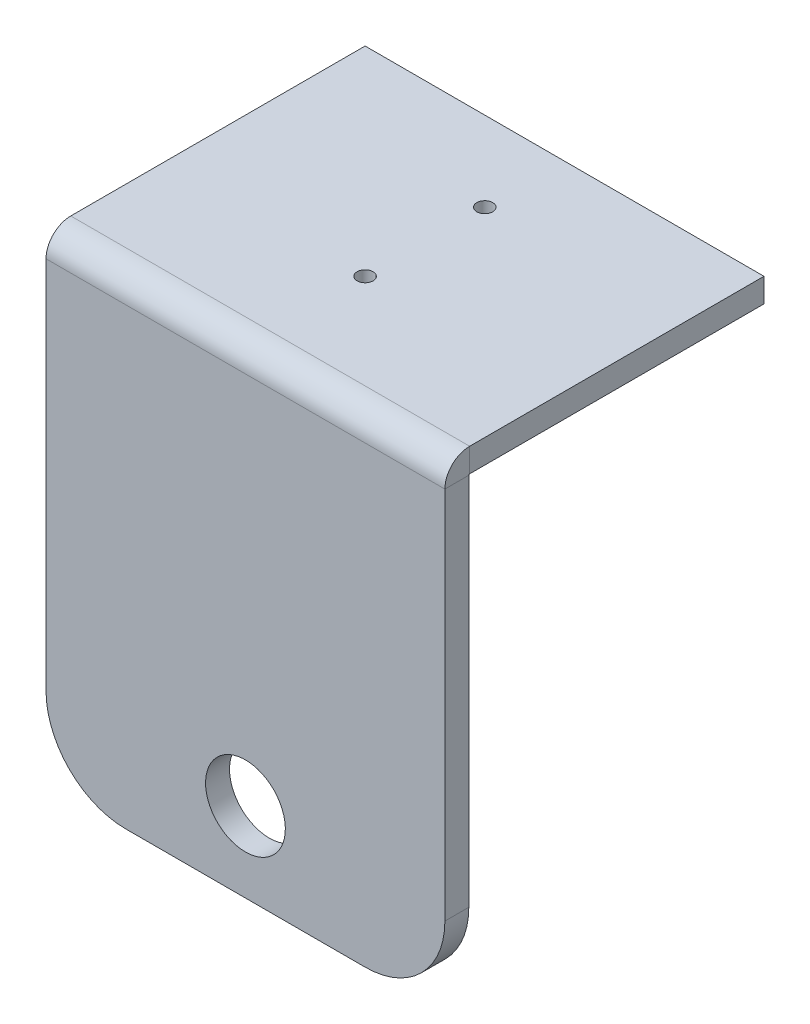
ISO-10303-21;
HEADER;
FILE_DESCRIPTION(('STEP AP214'),'2;1');
FILE_NAME('part.step','',(''),(''),'','','');
FILE_SCHEMA(('AUTOMOTIVE_DESIGN { 1 0 10303 214 1 1 1 1 }'));
ENDSEC;
DATA;
#1=APPLICATION_CONTEXT('core data for automotive mechanical design processes');
#2=APPLICATION_PROTOCOL_DEFINITION('international standard','automotive_design',2000,#1);
#3=PRODUCT_CONTEXT('',#1,'mechanical');
#4=PRODUCT('Part','Part','',(#3));
#5=PRODUCT_RELATED_PRODUCT_CATEGORY('part','',(#4));
#6=PRODUCT_DEFINITION_FORMATION('','',#4);
#7=PRODUCT_DEFINITION_CONTEXT('part definition',#1,'design');
#8=PRODUCT_DEFINITION('design','',#6,#7);
#9=PRODUCT_DEFINITION_SHAPE('','',#8);
#10=(LENGTH_UNIT() NAMED_UNIT(*) SI_UNIT(.MILLI.,.METRE.));
#11=(NAMED_UNIT(*) PLANE_ANGLE_UNIT() SI_UNIT($,.RADIAN.));
#12=(NAMED_UNIT(*) SI_UNIT($,.STERADIAN.) SOLID_ANGLE_UNIT());
#13=UNCERTAINTY_MEASURE_WITH_UNIT(LENGTH_MEASURE(1.E-05),#10,'distance_accuracy_value','');
#14=(GEOMETRIC_REPRESENTATION_CONTEXT(3) GLOBAL_UNCERTAINTY_ASSIGNED_CONTEXT((#13)) GLOBAL_UNIT_ASSIGNED_CONTEXT((#10,
#11,#12)) REPRESENTATION_CONTEXT('',''));
#15=CARTESIAN_POINT('',(0.,0.,0.));
#16=DIRECTION('',(0.,0.,1.));
#17=DIRECTION('',(1.,0.,0.));
#18=AXIS2_PLACEMENT_3D('',#15,#16,#17);
#19=CARTESIAN_POINT('',(-109.,280.,857.));
#20=DIRECTION('',(0.,1.,0.));
#21=DIRECTION('',(0.,0.,1.));
#22=AXIS2_PLACEMENT_3D('',#19,#20,#21);
#23=CYLINDRICAL_SURFACE('',#22,0.999999999999998);
#24=CARTESIAN_POINT('',(-109.,285.5,857.000000000001));
#25=DIRECTION('',(0.,-1.,0.));
#26=DIRECTION('',(1.,0.,0.));
#27=AXIS2_PLACEMENT_3D('',#24,#25,#26);
#28=CIRCLE('',#27,0.999999999999998);
#29=CARTESIAN_POINT('',(-108.,285.5,857.000000000001));
#30=VERTEX_POINT('',#29);
#31=EDGE_CURVE('E246',#30,#30,#28,.T.);
#32=ORIENTED_EDGE('',*,*,#31,.T.);
#33=EDGE_LOOP('',(#32));
#34=FACE_BOUND('',#33,.T.);
#35=CARTESIAN_POINT('',(-109.,288.5,857.000000000001));
#36=DIRECTION('',(0.,-1.,0.));
#37=DIRECTION('',(1.,0.,0.));
#38=AXIS2_PLACEMENT_3D('',#35,#36,#37);
#39=CIRCLE('',#38,0.999999999999998);
#40=CARTESIAN_POINT('',(-108.,288.5,857.000000000001));
#41=VERTEX_POINT('',#40);
#42=EDGE_CURVE('E207',#41,#41,#39,.T.);
#43=ORIENTED_EDGE('',*,*,#42,.F.);
#44=EDGE_LOOP('',(#43));
#45=FACE_BOUND('',#44,.T.);
#46=ADVANCED_FACE('F53',(#34,#45),#23,.F.);
#47=CARTESIAN_POINT('',(-109.,280.,842.000000000001));
#48=DIRECTION('',(0.,1.,0.));
#49=DIRECTION('',(0.,0.,1.));
#50=AXIS2_PLACEMENT_3D('',#47,#48,#49);
#51=CYLINDRICAL_SURFACE('',#50,0.999999999999998);
#52=CARTESIAN_POINT('',(-109.,285.5,842.000000000001));
#53=DIRECTION('',(0.,-1.,0.));
#54=DIRECTION('',(1.,0.,0.));
#55=AXIS2_PLACEMENT_3D('',#52,#53,#54);
#56=CIRCLE('',#55,0.999999999999998);
#57=CARTESIAN_POINT('',(-108.,285.5,842.000000000001));
#58=VERTEX_POINT('',#57);
#59=EDGE_CURVE('E242',#58,#58,#56,.T.);
#60=ORIENTED_EDGE('',*,*,#59,.T.);
#61=EDGE_LOOP('',(#60));
#62=FACE_BOUND('',#61,.T.);
#63=CARTESIAN_POINT('',(-109.,288.5,842.000000000001));
#64=DIRECTION('',(0.,-1.,0.));
#65=DIRECTION('',(1.,0.,0.));
#66=AXIS2_PLACEMENT_3D('',#63,#64,#65);
#67=CIRCLE('',#66,0.999999999999998);
#68=CARTESIAN_POINT('',(-108.,288.5,842.000000000001));
#69=VERTEX_POINT('',#68);
#70=EDGE_CURVE('E198',#69,#69,#67,.T.);
#71=ORIENTED_EDGE('',*,*,#70,.F.);
#72=EDGE_LOOP('',(#71));
#73=FACE_BOUND('',#72,.T.);
#74=ADVANCED_FACE('F437',(#62,#73),#51,.F.);
#75=CARTESIAN_POINT('',(-134.,164.216292298629,832.000000000001));
#76=DIRECTION('',(0.,0.,-1.));
#77=DIRECTION('',(0.,1.,0.));
#78=AXIS2_PLACEMENT_3D('',#75,#76,#77);
#79=PLANE('',#78);
#80=DIRECTION('',(1.,0.,0.));
#81=VECTOR('',#80,1.);
#82=CARTESIAN_POINT('',(-134.,288.5,832.000000000001));
#83=LINE('',#82,#81);
#84=CARTESIAN_POINT('',(-134.,288.5,832.000000000001));
#85=VERTEX_POINT('',#84);
#86=CARTESIAN_POINT('',(-83.9999999999999,288.5,832.000000000001));
#87=VERTEX_POINT('',#86);
#88=EDGE_CURVE('E205',#85,#87,#83,.T.);
#89=ORIENTED_EDGE('',*,*,#88,.T.);
#90=DIRECTION('',(0.,1.,0.));
#91=VECTOR('',#90,1.);
#92=CARTESIAN_POINT('',(-83.9999999999997,164.216292298629,832.000000000001));
#93=LINE('',#92,#91);
#94=CARTESIAN_POINT('',(-83.9999999999999,285.5,832.000000000001));
#95=VERTEX_POINT('',#94);
#96=EDGE_CURVE('E66',#95,#87,#93,.T.);
#97=ORIENTED_EDGE('',*,*,#96,.F.);
#98=DIRECTION('',(-1.,0.,0.));
#99=VECTOR('',#98,1.);
#100=CARTESIAN_POINT('',(-134.,285.5,832.000000000001));
#101=LINE('',#100,#99);
#102=CARTESIAN_POINT('',(-134.,285.5,832.000000000001));
#103=VERTEX_POINT('',#102);
#104=EDGE_CURVE('E78',#95,#103,#101,.T.);
#105=ORIENTED_EDGE('',*,*,#104,.T.);
#106=DIRECTION('',(0.,1.,0.));
#107=VECTOR('',#106,1.);
#108=CARTESIAN_POINT('',(-134.,164.216292298629,832.000000000001));
#109=LINE('',#108,#107);
#110=EDGE_CURVE('E199',#103,#85,#109,.T.);
#111=ORIENTED_EDGE('',*,*,#110,.T.);
#112=EDGE_LOOP('',(#89,#97,#105,#111));
#113=FACE_BOUND('',#112,.T.);
#114=ADVANCED_FACE('F277',(#113),#79,.T.);
#115=CARTESIAN_POINT('',(-134.,164.216292298628,900.));
#116=DIRECTION('',(1.,0.,0.));
#117=DIRECTION('',(0.,0.,-1.));
#118=AXIS2_PLACEMENT_3D('',#115,#116,#117);
#119=PLANE('',#118);
#120=DIRECTION('',(0.,1.,0.));
#121=VECTOR('',#120,1.);
#122=CARTESIAN_POINT('',(-134.,164.216292298628,868.9));
#123=LINE('',#122,#121);
#124=CARTESIAN_POINT('',(-134.,285.5,868.9));
#125=VERTEX_POINT('',#124);
#126=CARTESIAN_POINT('',(-134.,288.5,868.899999999999));
#127=VERTEX_POINT('',#126);
#128=EDGE_CURVE('E188',#125,#127,#123,.T.);
#129=ORIENTED_EDGE('',*,*,#128,.T.);
#130=DIRECTION('',(0.,0.,1.));
#131=VECTOR('',#130,1.);
#132=CARTESIAN_POINT('',(-134.,288.5,900.));
#133=LINE('',#132,#131);
#134=EDGE_CURVE('E106',#85,#127,#133,.T.);
#135=ORIENTED_EDGE('',*,*,#134,.F.);
#136=ORIENTED_EDGE('',*,*,#110,.F.);
#137=DIRECTION('',(0.,0.,1.));
#138=VECTOR('',#137,1.);
#139=CARTESIAN_POINT('',(-134.,285.5,900.));
#140=LINE('',#139,#138);
#141=EDGE_CURVE('E12',#125,#103,#140,.F.);
#142=ORIENTED_EDGE('',*,*,#141,.F.);
#143=EDGE_LOOP('',(#129,#135,#136,#142));
#144=FACE_BOUND('',#143,.T.);
#145=ADVANCED_FACE('F196',(#144),#119,.F.);
#146=CARTESIAN_POINT('',(-134.,288.5,832.000000000001));
#147=DIRECTION('',(0.,-1.,0.));
#148=DIRECTION('',(1.,0.,0.));
#149=AXIS2_PLACEMENT_3D('',#146,#147,#148);
#150=PLANE('',#149);
#151=ORIENTED_EDGE('',*,*,#70,.T.);
#152=EDGE_LOOP('',(#151));
#153=FACE_BOUND('',#152,.T.);
#154=ORIENTED_EDGE('',*,*,#42,.T.);
#155=EDGE_LOOP('',(#154));
#156=FACE_BOUND('',#155,.T.);
#157=ORIENTED_EDGE('',*,*,#134,.T.);
#158=DIRECTION('',(1.,0.,0.));
#159=VECTOR('',#158,1.);
#160=CARTESIAN_POINT('',(-134.,288.5,868.9));
#161=LINE('',#160,#159);
#162=CARTESIAN_POINT('',(-84.,288.5,868.9));
#163=VERTEX_POINT('',#162);
#164=EDGE_CURVE('E175',#127,#163,#161,.T.);
#165=ORIENTED_EDGE('',*,*,#164,.T.);
#166=DIRECTION('',(0.,0.,1.));
#167=VECTOR('',#166,1.);
#168=CARTESIAN_POINT('',(-84.0000000000001,288.5,900.));
#169=LINE('',#168,#167);
#170=EDGE_CURVE('E184',#87,#163,#169,.T.);
#171=ORIENTED_EDGE('',*,*,#170,.F.);
#172=ORIENTED_EDGE('',*,*,#88,.F.);
#173=EDGE_LOOP('',(#157,#165,#171,#172));
#174=FACE_BOUND('',#173,.T.);
#175=ADVANCED_FACE('F203',(#153,#156,#174),#150,.F.);
#176=CARTESIAN_POINT('',(-83.9999999999998,164.216292298628,900.));
#177=DIRECTION('',(1.,0.,0.));
#178=DIRECTION('',(0.,0.,-1.));
#179=AXIS2_PLACEMENT_3D('',#176,#177,#178);
#180=PLANE('',#179);
#181=ORIENTED_EDGE('',*,*,#170,.T.);
#182=DIRECTION('',(0.,1.,0.));
#183=VECTOR('',#182,1.);
#184=CARTESIAN_POINT('',(-83.9999999999998,164.216292298628,868.9));
#185=LINE('',#184,#183);
#186=CARTESIAN_POINT('',(-84.,285.5,868.9));
#187=VERTEX_POINT('',#186);
#188=EDGE_CURVE('E252',#187,#163,#185,.T.);
#189=ORIENTED_EDGE('',*,*,#188,.F.);
#190=DIRECTION('',(0.,0.,-1.));
#191=VECTOR('',#190,1.);
#192=CARTESIAN_POINT('',(-84.0000000000001,285.5,900.));
#193=LINE('',#192,#191);
#194=EDGE_CURVE('E234',#187,#95,#193,.T.);
#195=ORIENTED_EDGE('',*,*,#194,.T.);
#196=ORIENTED_EDGE('',*,*,#96,.T.);
#197=EDGE_LOOP('',(#181,#189,#195,#196));
#198=FACE_BOUND('',#197,.T.);
#199=ADVANCED_FACE('F275',(#198),#180,.T.);
#200=CARTESIAN_POINT('',(-134.,285.5,832.000000000001));
#201=DIRECTION('',(0.,-1.,0.));
#202=DIRECTION('',(1.,0.,0.));
#203=AXIS2_PLACEMENT_3D('',#200,#201,#202);
#204=PLANE('',#203);
#205=DIRECTION('',(1.,0.,0.));
#206=VECTOR('',#205,1.);
#207=CARTESIAN_POINT('',(-134.,285.5,868.9));
#208=LINE('',#207,#206);
#209=EDGE_CURVE('E58',#125,#187,#208,.T.);
#210=ORIENTED_EDGE('',*,*,#209,.F.);
#211=ORIENTED_EDGE('',*,*,#141,.T.);
#212=ORIENTED_EDGE('',*,*,#104,.F.);
#213=ORIENTED_EDGE('',*,*,#194,.F.);
#214=EDGE_LOOP('',(#210,#211,#212,#213));
#215=FACE_BOUND('',#214,.T.);
#216=ORIENTED_EDGE('',*,*,#59,.F.);
#217=EDGE_LOOP('',(#216));
#218=FACE_BOUND('',#217,.T.);
#219=ORIENTED_EDGE('',*,*,#31,.F.);
#220=EDGE_LOOP('',(#219));
#221=FACE_BOUND('',#220,.T.);
#222=ADVANCED_FACE('F56',(#215,#218,#221),#204,.T.);
#223=CARTESIAN_POINT('',(-134.,288.5,872.));
#224=DIRECTION('',(0.,0.,-1.));
#225=DIRECTION('',(0.,1.,0.));
#226=AXIS2_PLACEMENT_3D('',#223,#224,#225);
#227=PLANE('',#226);
#228=CARTESIAN_POINT('',(-109.,238.5,872.));
#229=DIRECTION('',(0.,0.,1.));
#230=DIRECTION('',(0.,-1.,0.));
#231=AXIS2_PLACEMENT_3D('',#228,#229,#230);
#232=CIRCLE('',#231,5.);
#233=CARTESIAN_POINT('',(-109.,233.5,872.));
#234=VERTEX_POINT('',#233);
#235=EDGE_CURVE('E340',#234,#234,#232,.T.);
#236=ORIENTED_EDGE('',*,*,#235,.F.);
#237=EDGE_LOOP('',(#236));
#238=FACE_BOUND('',#237,.T.);
#239=DIRECTION('',(1.,0.,0.));
#240=VECTOR('',#239,1.);
#241=CARTESIAN_POINT('',(-134.,285.4,872.));
#242=LINE('',#241,#240);
#243=CARTESIAN_POINT('',(-134.,285.4,872.));
#244=VERTEX_POINT('',#243);
#245=CARTESIAN_POINT('',(-84.,285.4,872.));
#246=VERTEX_POINT('',#245);
#247=EDGE_CURVE('E334',#244,#246,#242,.T.);
#248=ORIENTED_EDGE('',*,*,#247,.F.);
#249=DIRECTION('',(0.,1.,0.));
#250=VECTOR('',#249,1.);
#251=CARTESIAN_POINT('',(-134.,288.5,872.));
#252=LINE('',#251,#250);
#253=CARTESIAN_POINT('',(-134.,238.5,872.));
#254=VERTEX_POINT('',#253);
#255=EDGE_CURVE('E326',#254,#244,#252,.T.);
#256=ORIENTED_EDGE('',*,*,#255,.F.);
#257=CARTESIAN_POINT('',(-124.,238.5,872.));
#258=DIRECTION('',(0.,0.,-1.));
#259=DIRECTION('',(-1.,0.,0.));
#260=AXIS2_PLACEMENT_3D('',#257,#258,#259);
#261=CIRCLE('',#260,9.99999999999999);
#262=CARTESIAN_POINT('',(-124.,228.5,872.));
#263=VERTEX_POINT('',#262);
#264=EDGE_CURVE('E344',#263,#254,#261,.T.);
#265=ORIENTED_EDGE('',*,*,#264,.F.);
#266=DIRECTION('',(1.,0.,0.));
#267=VECTOR('',#266,1.);
#268=CARTESIAN_POINT('',(-134.,228.5,872.));
#269=LINE('',#268,#267);
#270=CARTESIAN_POINT('',(-94.,228.5,872.));
#271=VERTEX_POINT('',#270);
#272=EDGE_CURVE('E350',#271,#263,#269,.F.);
#273=ORIENTED_EDGE('',*,*,#272,.F.);
#274=CARTESIAN_POINT('',(-94.,238.5,872.));
#275=DIRECTION('',(0.,0.,1.));
#276=DIRECTION('',(1.,0.,0.));
#277=AXIS2_PLACEMENT_3D('',#274,#275,#276);
#278=CIRCLE('',#277,9.99999999999999);
#279=CARTESIAN_POINT('',(-84.,238.5,872.));
#280=VERTEX_POINT('',#279);
#281=EDGE_CURVE('E127',#280,#271,#278,.F.);
#282=ORIENTED_EDGE('',*,*,#281,.F.);
#283=DIRECTION('',(0.,1.,0.));
#284=VECTOR('',#283,1.);
#285=CARTESIAN_POINT('',(-84.,288.5,872.));
#286=LINE('',#285,#284);
#287=EDGE_CURVE('E117',#246,#280,#286,.F.);
#288=ORIENTED_EDGE('',*,*,#287,.F.);
#289=EDGE_LOOP('',(#248,#256,#265,#273,#282,#288));
#290=FACE_BOUND('',#289,.T.);
#291=ADVANCED_FACE('F372',(#238,#290),#227,.F.);
#292=CARTESIAN_POINT('',(-134.,288.5,869.));
#293=DIRECTION('',(0.,0.,-1.));
#294=DIRECTION('',(0.,1.,0.));
#295=AXIS2_PLACEMENT_3D('',#292,#293,#294);
#296=PLANE('',#295);
#297=CARTESIAN_POINT('',(-109.,238.5,869.));
#298=DIRECTION('',(0.,0.,1.));
#299=DIRECTION('',(0.,-1.,0.));
#300=AXIS2_PLACEMENT_3D('',#297,#298,#299);
#301=CIRCLE('',#300,5.);
#302=CARTESIAN_POINT('',(-109.,233.5,869.));
#303=VERTEX_POINT('',#302);
#304=EDGE_CURVE('E345',#303,#303,#301,.T.);
#305=ORIENTED_EDGE('',*,*,#304,.T.);
#306=EDGE_LOOP('',(#305));
#307=FACE_BOUND('',#306,.T.);
#308=DIRECTION('',(0.,1.,0.));
#309=VECTOR('',#308,1.);
#310=CARTESIAN_POINT('',(-134.,0.,869.));
#311=LINE('',#310,#309);
#312=CARTESIAN_POINT('',(-134.,238.5,869.));
#313=VERTEX_POINT('',#312);
#314=CARTESIAN_POINT('',(-134.,285.4,869.));
#315=VERTEX_POINT('',#314);
#316=EDGE_CURVE('E306',#313,#315,#311,.T.);
#317=ORIENTED_EDGE('',*,*,#316,.T.);
#318=DIRECTION('',(1.,0.,0.));
#319=VECTOR('',#318,1.);
#320=CARTESIAN_POINT('',(-134.,285.4,869.));
#321=LINE('',#320,#319);
#322=CARTESIAN_POINT('',(-84.,285.4,869.));
#323=VERTEX_POINT('',#322);
#324=EDGE_CURVE('E328',#315,#323,#321,.T.);
#325=ORIENTED_EDGE('',*,*,#324,.T.);
#326=DIRECTION('',(0.,1.,0.));
#327=VECTOR('',#326,1.);
#328=CARTESIAN_POINT('',(-84.,0.,869.));
#329=LINE('',#328,#327);
#330=CARTESIAN_POINT('',(-84.,238.5,869.));
#331=VERTEX_POINT('',#330);
#332=EDGE_CURVE('E310',#331,#323,#329,.T.);
#333=ORIENTED_EDGE('',*,*,#332,.F.);
#334=CARTESIAN_POINT('',(-94.,238.5,869.));
#335=DIRECTION('',(0.,0.,1.));
#336=DIRECTION('',(1.,0.,0.));
#337=AXIS2_PLACEMENT_3D('',#334,#335,#336);
#338=CIRCLE('',#337,9.99999999999999);
#339=CARTESIAN_POINT('',(-94.,228.5,869.));
#340=VERTEX_POINT('',#339);
#341=EDGE_CURVE('E408',#340,#331,#338,.T.);
#342=ORIENTED_EDGE('',*,*,#341,.F.);
#343=DIRECTION('',(1.,0.,0.));
#344=VECTOR('',#343,1.);
#345=CARTESIAN_POINT('',(-134.,228.5,869.));
#346=LINE('',#345,#344);
#347=CARTESIAN_POINT('',(-124.,228.5,869.));
#348=VERTEX_POINT('',#347);
#349=EDGE_CURVE('E295',#348,#340,#346,.T.);
#350=ORIENTED_EDGE('',*,*,#349,.F.);
#351=CARTESIAN_POINT('',(-124.,238.5,869.));
#352=DIRECTION('',(0.,0.,-1.));
#353=DIRECTION('',(-1.,0.,0.));
#354=AXIS2_PLACEMENT_3D('',#351,#352,#353);
#355=CIRCLE('',#354,9.99999999999999);
#356=EDGE_CURVE('E301',#313,#348,#355,.F.);
#357=ORIENTED_EDGE('',*,*,#356,.F.);
#358=EDGE_LOOP('',(#317,#325,#333,#342,#350,#357));
#359=FACE_BOUND('',#358,.T.);
#360=ADVANCED_FACE('F394',(#307,#359),#296,.T.);
#361=CARTESIAN_POINT('',(-109.,238.5,0.));
#362=DIRECTION('',(0.,0.,1.));
#363=DIRECTION('',(0.,-1.,0.));
#364=AXIS2_PLACEMENT_3D('',#361,#362,#363);
#365=CYLINDRICAL_SURFACE('',#364,5.);
#366=ORIENTED_EDGE('',*,*,#304,.F.);
#367=EDGE_LOOP('',(#366));
#368=FACE_BOUND('',#367,.T.);
#369=ORIENTED_EDGE('',*,*,#235,.T.);
#370=EDGE_LOOP('',(#369));
#371=FACE_BOUND('',#370,.T.);
#372=ADVANCED_FACE('F420',(#368,#371),#365,.F.);
#373=CARTESIAN_POINT('',(-134.,0.,720.505973715132));
#374=DIRECTION('',(1.,0.,0.));
#375=DIRECTION('',(0.,0.,-1.));
#376=AXIS2_PLACEMENT_3D('',#373,#374,#375);
#377=PLANE('',#376);
#378=DIRECTION('',(0.,0.,1.));
#379=VECTOR('',#378,1.);
#380=CARTESIAN_POINT('',(-134.,238.5,720.505973715132));
#381=LINE('',#380,#379);
#382=EDGE_CURVE('E368',#313,#254,#381,.T.);
#383=ORIENTED_EDGE('',*,*,#382,.T.);
#384=ORIENTED_EDGE('',*,*,#255,.T.);
#385=DIRECTION('',(0.,0.,1.));
#386=VECTOR('',#385,1.);
#387=CARTESIAN_POINT('',(-134.,285.4,720.505973715132));
#388=LINE('',#387,#386);
#389=EDGE_CURVE('E191',#315,#244,#388,.T.);
#390=ORIENTED_EDGE('',*,*,#389,.F.);
#391=ORIENTED_EDGE('',*,*,#316,.F.);
#392=EDGE_LOOP('',(#383,#384,#390,#391));
#393=FACE_BOUND('',#392,.T.);
#394=ADVANCED_FACE('F365',(#393),#377,.F.);
#395=CARTESIAN_POINT('',(-84.,0.,720.505973715132));
#396=DIRECTION('',(1.,0.,0.));
#397=DIRECTION('',(0.,0.,-1.));
#398=AXIS2_PLACEMENT_3D('',#395,#396,#397);
#399=PLANE('',#398);
#400=ORIENTED_EDGE('',*,*,#287,.T.);
#401=DIRECTION('',(0.,0.,1.));
#402=VECTOR('',#401,1.);
#403=CARTESIAN_POINT('',(-84.,238.5,720.505973715132));
#404=LINE('',#403,#402);
#405=EDGE_CURVE('E264',#331,#280,#404,.T.);
#406=ORIENTED_EDGE('',*,*,#405,.F.);
#407=ORIENTED_EDGE('',*,*,#332,.T.);
#408=DIRECTION('',(0.,0.,1.));
#409=VECTOR('',#408,1.);
#410=CARTESIAN_POINT('',(-84.,285.4,720.505973715132));
#411=LINE('',#410,#409);
#412=EDGE_CURVE('E261',#323,#246,#411,.T.);
#413=ORIENTED_EDGE('',*,*,#412,.T.);
#414=EDGE_LOOP('',(#400,#406,#407,#413));
#415=FACE_BOUND('',#414,.T.);
#416=ADVANCED_FACE('F409',(#415),#399,.T.);
#417=CARTESIAN_POINT('',(-94.,238.5,720.505973715132));
#418=DIRECTION('',(0.,0.,1.));
#419=DIRECTION('',(0.,-1.,0.));
#420=AXIS2_PLACEMENT_3D('',#417,#418,#419);
#421=CYLINDRICAL_SURFACE('',#420,9.99999999999999);
#422=ORIENTED_EDGE('',*,*,#281,.T.);
#423=DIRECTION('',(0.,0.,1.));
#424=VECTOR('',#423,1.);
#425=CARTESIAN_POINT('',(-94.,228.5,720.505973715132));
#426=LINE('',#425,#424);
#427=EDGE_CURVE('E401',#340,#271,#426,.T.);
#428=ORIENTED_EDGE('',*,*,#427,.F.);
#429=ORIENTED_EDGE('',*,*,#341,.T.);
#430=ORIENTED_EDGE('',*,*,#405,.T.);
#431=EDGE_LOOP('',(#422,#428,#429,#430));
#432=FACE_BOUND('',#431,.T.);
#433=ADVANCED_FACE('F407',(#432),#421,.T.);
#434=CARTESIAN_POINT('',(-134.,228.5,720.505973715132));
#435=DIRECTION('',(0.,-1.,0.));
#436=DIRECTION('',(0.,0.,-1.));
#437=AXIS2_PLACEMENT_3D('',#434,#435,#436);
#438=PLANE('',#437);
#439=ORIENTED_EDGE('',*,*,#272,.T.);
#440=DIRECTION('',(0.,0.,1.));
#441=VECTOR('',#440,1.);
#442=CARTESIAN_POINT('',(-124.,228.5,720.505973715132));
#443=LINE('',#442,#441);
#444=EDGE_CURVE('E375',#348,#263,#443,.T.);
#445=ORIENTED_EDGE('',*,*,#444,.F.);
#446=ORIENTED_EDGE('',*,*,#349,.T.);
#447=ORIENTED_EDGE('',*,*,#427,.T.);
#448=EDGE_LOOP('',(#439,#445,#446,#447));
#449=FACE_BOUND('',#448,.T.);
#450=ADVANCED_FACE('F400',(#449),#438,.T.);
#451=CARTESIAN_POINT('',(-124.,238.5,720.505973715132));
#452=DIRECTION('',(0.,0.,1.));
#453=DIRECTION('',(0.,-1.,0.));
#454=AXIS2_PLACEMENT_3D('',#451,#452,#453);
#455=CYLINDRICAL_SURFACE('',#454,9.99999999999999);
#456=ORIENTED_EDGE('',*,*,#264,.T.);
#457=ORIENTED_EDGE('',*,*,#382,.F.);
#458=ORIENTED_EDGE('',*,*,#356,.T.);
#459=ORIENTED_EDGE('',*,*,#444,.T.);
#460=EDGE_LOOP('',(#456,#457,#458,#459));
#461=FACE_BOUND('',#460,.T.);
#462=ADVANCED_FACE('F396',(#461),#455,.T.);
#463=CARTESIAN_POINT('',(-84.,285.4,868.9));
#464=DIRECTION('',(1.,0.,0.));
#465=DIRECTION('',(0.,0.,-1.));
#466=AXIS2_PLACEMENT_3D('',#463,#464,#465);
#467=PLANE('',#466);
#468=ORIENTED_EDGE('',*,*,#412,.F.);
#469=CARTESIAN_POINT('',(-84.,285.4,868.9));
#470=DIRECTION('',(1.,0.,0.));
#471=DIRECTION('',(0.,1.,0.));
#472=AXIS2_PLACEMENT_3D('',#469,#470,#471);
#473=CIRCLE('',#472,0.0999999999999777);
#474=EDGE_CURVE('E193',#323,#187,#473,.F.);
#475=ORIENTED_EDGE('',*,*,#474,.T.);
#476=ORIENTED_EDGE('',*,*,#188,.T.);
#477=CARTESIAN_POINT('',(-84.,285.4,868.9));
#478=DIRECTION('',(1.,0.,0.));
#479=DIRECTION('',(0.,1.,0.));
#480=AXIS2_PLACEMENT_3D('',#477,#478,#479);
#481=CIRCLE('',#480,3.09999999999981);
#482=EDGE_CURVE('E96',#246,#163,#481,.F.);
#483=ORIENTED_EDGE('',*,*,#482,.F.);
#484=EDGE_LOOP('',(#468,#475,#476,#483));
#485=FACE_BOUND('',#484,.T.);
#486=ADVANCED_FACE('F389',(#485),#467,.T.);
#487=CARTESIAN_POINT('',(-134.,285.4,868.9));
#488=DIRECTION('',(-1.,0.,0.));
#489=DIRECTION('',(0.,0.,1.));
#490=AXIS2_PLACEMENT_3D('',#487,#488,#489);
#491=PLANE('',#490);
#492=ORIENTED_EDGE('',*,*,#128,.F.);
#493=CARTESIAN_POINT('',(-134.,285.4,868.9));
#494=DIRECTION('',(1.,0.,0.));
#495=DIRECTION('',(0.,1.,0.));
#496=AXIS2_PLACEMENT_3D('',#493,#494,#495);
#497=CIRCLE('',#496,0.0999999999999777);
#498=EDGE_CURVE('E382',#125,#315,#497,.T.);
#499=ORIENTED_EDGE('',*,*,#498,.T.);
#500=ORIENTED_EDGE('',*,*,#389,.T.);
#501=CARTESIAN_POINT('',(-134.,285.4,868.9));
#502=DIRECTION('',(1.,0.,0.));
#503=DIRECTION('',(0.,1.,0.));
#504=AXIS2_PLACEMENT_3D('',#501,#502,#503);
#505=CIRCLE('',#504,3.09999999999981);
#506=EDGE_CURVE('E178',#127,#244,#505,.T.);
#507=ORIENTED_EDGE('',*,*,#506,.F.);
#508=EDGE_LOOP('',(#492,#499,#500,#507));
#509=FACE_BOUND('',#508,.T.);
#510=ADVANCED_FACE('F187',(#509),#491,.T.);
#511=CARTESIAN_POINT('',(-241.042988349752,285.4,868.9));
#512=DIRECTION('',(1.,0.,0.));
#513=DIRECTION('',(0.,1.,0.));
#514=AXIS2_PLACEMENT_3D('',#511,#512,#513);
#515=CYLINDRICAL_SURFACE('',#514,3.09999999999981);
#516=ORIENTED_EDGE('',*,*,#506,.T.);
#517=ORIENTED_EDGE('',*,*,#247,.T.);
#518=ORIENTED_EDGE('',*,*,#482,.T.);
#519=ORIENTED_EDGE('',*,*,#164,.F.);
#520=EDGE_LOOP('',(#516,#517,#518,#519));
#521=FACE_BOUND('',#520,.T.);
#522=ADVANCED_FACE('F177',(#521),#515,.T.);
#523=CARTESIAN_POINT('',(-241.042988349752,285.4,868.9));
#524=DIRECTION('',(1.,0.,0.));
#525=DIRECTION('',(0.,1.,0.));
#526=AXIS2_PLACEMENT_3D('',#523,#524,#525);
#527=CYLINDRICAL_SURFACE('',#526,0.0999999999999777);
#528=ORIENTED_EDGE('',*,*,#498,.F.);
#529=ORIENTED_EDGE('',*,*,#209,.T.);
#530=ORIENTED_EDGE('',*,*,#474,.F.);
#531=ORIENTED_EDGE('',*,*,#324,.F.);
#532=EDGE_LOOP('',(#528,#529,#530,#531));
#533=FACE_BOUND('',#532,.T.);
#534=ADVANCED_FACE('F391',(#533),#527,.F.);
#535=CLOSED_SHELL('',(#46,#74,#114,#145,#175,#199,#222,#291,#360,#372,#394,#416,#433,#450,#462,
#486,#510,#522,#534));
#536=MANIFOLD_SOLID_BREP('B2',#535);
#537=ADVANCED_BREP_SHAPE_REPRESENTATION('',(#18,#536),#14);
#538=SHAPE_DEFINITION_REPRESENTATION(#9,#537);
ENDSEC;
END-ISO-10303-21;
